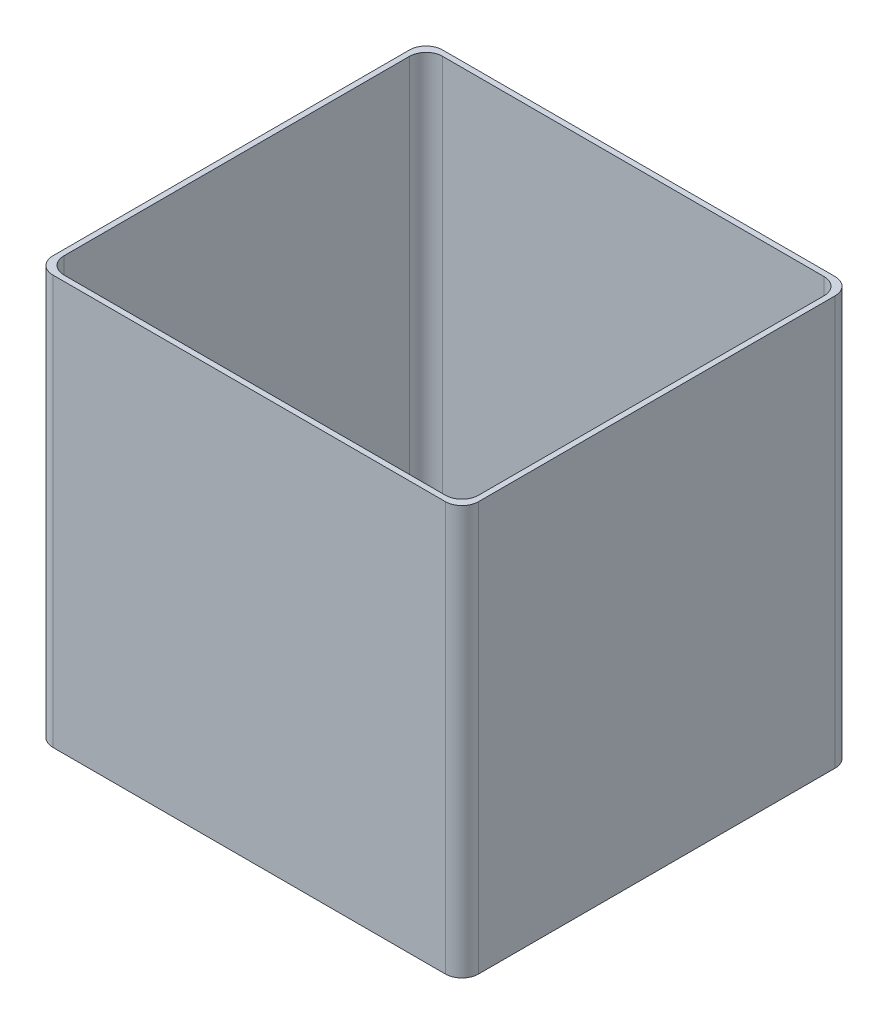
ISO-10303-21;
HEADER;
FILE_DESCRIPTION(('STEP AP214'),'2;1');
FILE_NAME('part.step','',(''),(''),'','','');
FILE_SCHEMA(('AUTOMOTIVE_DESIGN { 1 0 10303 214 1 1 1 1 }'));
ENDSEC;
DATA;
#1=APPLICATION_CONTEXT('core data for automotive mechanical design processes');
#2=APPLICATION_PROTOCOL_DEFINITION('international standard','automotive_design',2000,#1);
#3=PRODUCT_CONTEXT('',#1,'mechanical');
#4=PRODUCT('Part','Part','',(#3));
#5=PRODUCT_RELATED_PRODUCT_CATEGORY('part','',(#4));
#6=PRODUCT_DEFINITION_FORMATION('','',#4);
#7=PRODUCT_DEFINITION_CONTEXT('part definition',#1,'design');
#8=PRODUCT_DEFINITION('design','',#6,#7);
#9=PRODUCT_DEFINITION_SHAPE('','',#8);
#10=(LENGTH_UNIT() NAMED_UNIT(*) SI_UNIT(.MILLI.,.METRE.));
#11=(NAMED_UNIT(*) PLANE_ANGLE_UNIT() SI_UNIT($,.RADIAN.));
#12=(NAMED_UNIT(*) SI_UNIT($,.STERADIAN.) SOLID_ANGLE_UNIT());
#13=UNCERTAINTY_MEASURE_WITH_UNIT(LENGTH_MEASURE(1.E-05),#10,'distance_accuracy_value','');
#14=(GEOMETRIC_REPRESENTATION_CONTEXT(3) GLOBAL_UNCERTAINTY_ASSIGNED_CONTEXT((#13)) GLOBAL_UNIT_ASSIGNED_CONTEXT((#10,
#11,#12)) REPRESENTATION_CONTEXT('',''));
#15=CARTESIAN_POINT('',(0.,0.,0.));
#16=DIRECTION('',(0.,0.,1.));
#17=DIRECTION('',(1.,0.,0.));
#18=AXIS2_PLACEMENT_3D('',#15,#16,#17);
#19=CARTESIAN_POINT('',(54.9031303622844,148.,-101.613007283359));
#20=DIRECTION('',(0.,-1.,0.));
#21=DIRECTION('',(0.,0.,-1.));
#22=AXIS2_PLACEMENT_3D('',#19,#20,#21);
#23=CYLINDRICAL_SURFACE('',#22,6.);
#24=DIRECTION('',(0.,1.,0.));
#25=VECTOR('',#24,1.);
#26=CARTESIAN_POINT('',(54.9031303622844,148.,-107.613007283359));
#27=LINE('',#26,#25);
#28=CARTESIAN_POINT('',(54.9031303622844,2.,-107.613007283359));
#29=VERTEX_POINT('',#28);
#30=CARTESIAN_POINT('',(54.9031303622844,148.,-107.613007283359));
#31=VERTEX_POINT('',#30);
#32=EDGE_CURVE('E243',#29,#31,#27,.T.);
#33=ORIENTED_EDGE('',*,*,#32,.F.);
#34=CARTESIAN_POINT('',(54.9031303622844,2.,-101.613007283359));
#35=DIRECTION('',(0.,-1.,0.));
#36=DIRECTION('',(0.,0.,-1.));
#37=AXIS2_PLACEMENT_3D('',#34,#35,#36);
#38=CIRCLE('',#37,6.);
#39=CARTESIAN_POINT('',(60.9031303622844,2.,-101.613007283359));
#40=VERTEX_POINT('',#39);
#41=EDGE_CURVE('E40',#40,#29,#38,.F.);
#42=ORIENTED_EDGE('',*,*,#41,.F.);
#43=DIRECTION('',(0.,1.,0.));
#44=VECTOR('',#43,1.);
#45=CARTESIAN_POINT('',(60.9031303622844,148.,-101.613007283359));
#46=LINE('',#45,#44);
#47=CARTESIAN_POINT('',(60.9031303622844,148.,-101.613007283359));
#48=VERTEX_POINT('',#47);
#49=EDGE_CURVE('E246',#48,#40,#46,.F.);
#50=ORIENTED_EDGE('',*,*,#49,.F.);
#51=CARTESIAN_POINT('',(54.9031303622844,148.,-101.613007283359));
#52=DIRECTION('',(0.,1.,0.));
#53=DIRECTION('',(0.,0.,1.));
#54=AXIS2_PLACEMENT_3D('',#51,#52,#53);
#55=CIRCLE('',#54,6.);
#56=EDGE_CURVE('E11',#48,#31,#55,.T.);
#57=ORIENTED_EDGE('',*,*,#56,.T.);
#58=EDGE_LOOP('',(#33,#42,#50,#57));
#59=FACE_BOUND('',#58,.T.);
#60=ADVANCED_FACE('F33',(#59),#23,.F.);
#61=CARTESIAN_POINT('',(-83.0968696377156,148.,-101.613007283359));
#62=DIRECTION('',(0.,1.,0.));
#63=DIRECTION('',(0.,0.,1.));
#64=AXIS2_PLACEMENT_3D('',#61,#62,#63);
#65=CYLINDRICAL_SURFACE('',#64,6.);
#66=DIRECTION('',(0.,-1.,0.));
#67=VECTOR('',#66,1.);
#68=CARTESIAN_POINT('',(-83.0968696377156,148.,-107.613007283359));
#69=LINE('',#68,#67);
#70=CARTESIAN_POINT('',(-83.0968696377156,148.,-107.613007283359));
#71=VERTEX_POINT('',#70);
#72=CARTESIAN_POINT('',(-83.0968696377156,2.,-107.613007283359));
#73=VERTEX_POINT('',#72);
#74=EDGE_CURVE('E233',#71,#73,#69,.T.);
#75=ORIENTED_EDGE('',*,*,#74,.F.);
#76=CARTESIAN_POINT('',(-83.0968696377156,148.,-101.613007283359));
#77=DIRECTION('',(0.,1.,0.));
#78=DIRECTION('',(0.,0.,1.));
#79=AXIS2_PLACEMENT_3D('',#76,#77,#78);
#80=CIRCLE('',#79,6.);
#81=CARTESIAN_POINT('',(-89.0968696377156,148.,-101.613007283359));
#82=VERTEX_POINT('',#81);
#83=EDGE_CURVE('E241',#71,#82,#80,.T.);
#84=ORIENTED_EDGE('',*,*,#83,.T.);
#85=DIRECTION('',(0.,-1.,0.));
#86=VECTOR('',#85,1.);
#87=CARTESIAN_POINT('',(-89.0968696377156,148.,-101.613007283359));
#88=LINE('',#87,#86);
#89=CARTESIAN_POINT('',(-89.0968696377156,2.,-101.613007283359));
#90=VERTEX_POINT('',#89);
#91=EDGE_CURVE('E236',#90,#82,#88,.F.);
#92=ORIENTED_EDGE('',*,*,#91,.F.);
#93=CARTESIAN_POINT('',(-83.0968696377156,2.,-101.613007283359));
#94=DIRECTION('',(0.,-1.,0.));
#95=DIRECTION('',(0.,0.,-1.));
#96=AXIS2_PLACEMENT_3D('',#93,#94,#95);
#97=CIRCLE('',#96,6.);
#98=EDGE_CURVE('E239',#73,#90,#97,.F.);
#99=ORIENTED_EDGE('',*,*,#98,.F.);
#100=EDGE_LOOP('',(#75,#84,#92,#99));
#101=FACE_BOUND('',#100,.T.);
#102=ADVANCED_FACE('F312',(#101),#65,.F.);
#103=CARTESIAN_POINT('',(-85.0968696377156,148.,-103.613007283359));
#104=DIRECTION('',(0.,-1.,0.));
#105=DIRECTION('',(0.,0.,-1.));
#106=AXIS2_PLACEMENT_3D('',#103,#104,#105);
#107=CYLINDRICAL_SURFACE('',#106,6.);
#108=DIRECTION('',(0.,-1.,0.));
#109=VECTOR('',#108,1.);
#110=CARTESIAN_POINT('',(-91.0968696377156,148.,-103.613007283359));
#111=LINE('',#110,#109);
#112=CARTESIAN_POINT('',(-91.0968696377156,148.,-103.613007283359));
#113=VERTEX_POINT('',#112);
#114=CARTESIAN_POINT('',(-91.0968696377156,0.,-103.613007283359));
#115=VERTEX_POINT('',#114);
#116=EDGE_CURVE('E223',#113,#115,#111,.T.);
#117=ORIENTED_EDGE('',*,*,#116,.F.);
#118=CARTESIAN_POINT('',(-85.0968696377156,148.,-103.613007283359));
#119=DIRECTION('',(0.,1.,0.));
#120=DIRECTION('',(0.,0.,1.));
#121=AXIS2_PLACEMENT_3D('',#118,#119,#120);
#122=CIRCLE('',#121,6.);
#123=CARTESIAN_POINT('',(-85.0968696377156,148.,-109.613007283359));
#124=VERTEX_POINT('',#123);
#125=EDGE_CURVE('E229',#124,#113,#122,.T.);
#126=ORIENTED_EDGE('',*,*,#125,.F.);
#127=DIRECTION('',(0.,-1.,0.));
#128=VECTOR('',#127,1.);
#129=CARTESIAN_POINT('',(-85.0968696377156,148.,-109.613007283359));
#130=LINE('',#129,#128);
#131=CARTESIAN_POINT('',(-85.0968696377156,0.,-109.613007283359));
#132=VERTEX_POINT('',#131);
#133=EDGE_CURVE('E226',#132,#124,#130,.F.);
#134=ORIENTED_EDGE('',*,*,#133,.F.);
#135=CARTESIAN_POINT('',(-85.0968696377156,0.,-103.613007283359));
#136=DIRECTION('',(0.,1.,0.));
#137=DIRECTION('',(0.,0.,1.));
#138=AXIS2_PLACEMENT_3D('',#135,#136,#137);
#139=CIRCLE('',#138,6.);
#140=EDGE_CURVE('E231',#115,#132,#139,.F.);
#141=ORIENTED_EDGE('',*,*,#140,.F.);
#142=EDGE_LOOP('',(#117,#126,#134,#141));
#143=FACE_BOUND('',#142,.T.);
#144=ADVANCED_FACE('F295',(#143),#107,.T.);
#145=CARTESIAN_POINT('',(56.9031303622844,148.,-103.613007283359));
#146=DIRECTION('',(0.,-1.,0.));
#147=DIRECTION('',(0.,0.,-1.));
#148=AXIS2_PLACEMENT_3D('',#145,#146,#147);
#149=CYLINDRICAL_SURFACE('',#148,6.);
#150=DIRECTION('',(0.,-1.,0.));
#151=VECTOR('',#150,1.);
#152=CARTESIAN_POINT('',(56.9031303622844,148.,-109.613007283359));
#153=LINE('',#152,#151);
#154=CARTESIAN_POINT('',(56.9031303622844,148.,-109.613007283359));
#155=VERTEX_POINT('',#154);
#156=CARTESIAN_POINT('',(56.9031303622844,0.,-109.613007283359));
#157=VERTEX_POINT('',#156);
#158=EDGE_CURVE('E215',#155,#157,#153,.T.);
#159=ORIENTED_EDGE('',*,*,#158,.F.);
#160=CARTESIAN_POINT('',(56.9031303622844,148.,-103.613007283359));
#161=DIRECTION('',(0.,1.,0.));
#162=DIRECTION('',(0.,0.,1.));
#163=AXIS2_PLACEMENT_3D('',#160,#161,#162);
#164=CIRCLE('',#163,6.);
#165=CARTESIAN_POINT('',(62.9031303622844,148.,-103.613007283359));
#166=VERTEX_POINT('',#165);
#167=EDGE_CURVE('E220',#166,#155,#164,.T.);
#168=ORIENTED_EDGE('',*,*,#167,.F.);
#169=DIRECTION('',(0.,-1.,0.));
#170=VECTOR('',#169,1.);
#171=CARTESIAN_POINT('',(62.9031303622844,148.,-103.613007283359));
#172=LINE('',#171,#170);
#173=CARTESIAN_POINT('',(62.9031303622844,0.,-103.613007283359));
#174=VERTEX_POINT('',#173);
#175=EDGE_CURVE('E218',#174,#166,#172,.F.);
#176=ORIENTED_EDGE('',*,*,#175,.F.);
#177=CARTESIAN_POINT('',(56.9031303622844,0.,-103.613007283359));
#178=DIRECTION('',(0.,1.,0.));
#179=DIRECTION('',(0.,0.,1.));
#180=AXIS2_PLACEMENT_3D('',#177,#178,#179);
#181=CIRCLE('',#180,6.);
#182=EDGE_CURVE('E170',#157,#174,#181,.F.);
#183=ORIENTED_EDGE('',*,*,#182,.F.);
#184=EDGE_LOOP('',(#159,#168,#176,#183));
#185=FACE_BOUND('',#184,.T.);
#186=ADVANCED_FACE('F300',(#185),#149,.T.);
#187=CARTESIAN_POINT('',(-85.0968696377156,148.,25.3869927166415));
#188=DIRECTION('',(0.,1.,0.));
#189=DIRECTION('',(0.,0.,1.));
#190=AXIS2_PLACEMENT_3D('',#187,#188,#189);
#191=CYLINDRICAL_SURFACE('',#190,6.);
#192=DIRECTION('',(0.,1.,0.));
#193=VECTOR('',#192,1.);
#194=CARTESIAN_POINT('',(-91.0968696377156,148.,25.3869927166415));
#195=LINE('',#194,#193);
#196=CARTESIAN_POINT('',(-91.0968696377156,0.,25.3869927166415));
#197=VERTEX_POINT('',#196);
#198=CARTESIAN_POINT('',(-91.0968696377156,148.,25.3869927166415));
#199=VERTEX_POINT('',#198);
#200=EDGE_CURVE('E204',#197,#199,#195,.T.);
#201=ORIENTED_EDGE('',*,*,#200,.F.);
#202=CARTESIAN_POINT('',(-85.0968696377156,0.,25.3869927166415));
#203=DIRECTION('',(0.,1.,0.));
#204=DIRECTION('',(0.,0.,1.));
#205=AXIS2_PLACEMENT_3D('',#202,#203,#204);
#206=CIRCLE('',#205,6.);
#207=CARTESIAN_POINT('',(-85.0968696377156,0.,31.3869927166415));
#208=VERTEX_POINT('',#207);
#209=EDGE_CURVE('E210',#208,#197,#206,.F.);
#210=ORIENTED_EDGE('',*,*,#209,.F.);
#211=DIRECTION('',(0.,1.,0.));
#212=VECTOR('',#211,1.);
#213=CARTESIAN_POINT('',(-85.0968696377156,148.,31.3869927166415));
#214=LINE('',#213,#212);
#215=CARTESIAN_POINT('',(-85.0968696377156,148.,31.3869927166415));
#216=VERTEX_POINT('',#215);
#217=EDGE_CURVE('E207',#216,#208,#214,.F.);
#218=ORIENTED_EDGE('',*,*,#217,.F.);
#219=CARTESIAN_POINT('',(-85.0968696377156,148.,25.3869927166415));
#220=DIRECTION('',(0.,1.,0.));
#221=DIRECTION('',(0.,0.,1.));
#222=AXIS2_PLACEMENT_3D('',#219,#220,#221);
#223=CIRCLE('',#222,6.);
#224=EDGE_CURVE('E213',#199,#216,#223,.T.);
#225=ORIENTED_EDGE('',*,*,#224,.F.);
#226=EDGE_LOOP('',(#201,#210,#218,#225));
#227=FACE_BOUND('',#226,.T.);
#228=ADVANCED_FACE('F288',(#227),#191,.T.);
#229=CARTESIAN_POINT('',(-83.0968696377156,148.,23.3869927166415));
#230=DIRECTION('',(0.,1.,0.));
#231=DIRECTION('',(0.,0.,1.));
#232=AXIS2_PLACEMENT_3D('',#229,#230,#231);
#233=CYLINDRICAL_SURFACE('',#232,6.);
#234=DIRECTION('',(0.,-1.,0.));
#235=VECTOR('',#234,1.);
#236=CARTESIAN_POINT('',(-89.0968696377156,148.,23.3869927166415));
#237=LINE('',#236,#235);
#238=CARTESIAN_POINT('',(-89.0968696377156,148.,23.3869927166415));
#239=VERTEX_POINT('',#238);
#240=CARTESIAN_POINT('',(-89.0968696377156,2.,23.3869927166415));
#241=VERTEX_POINT('',#240);
#242=EDGE_CURVE('E194',#239,#241,#237,.T.);
#243=ORIENTED_EDGE('',*,*,#242,.F.);
#244=CARTESIAN_POINT('',(-83.0968696377156,148.,23.3869927166415));
#245=DIRECTION('',(0.,1.,0.));
#246=DIRECTION('',(0.,0.,1.));
#247=AXIS2_PLACEMENT_3D('',#244,#245,#246);
#248=CIRCLE('',#247,6.);
#249=CARTESIAN_POINT('',(-83.0968696377156,148.,29.3869927166415));
#250=VERTEX_POINT('',#249);
#251=EDGE_CURVE('E202',#239,#250,#248,.T.);
#252=ORIENTED_EDGE('',*,*,#251,.T.);
#253=DIRECTION('',(0.,-1.,0.));
#254=VECTOR('',#253,1.);
#255=CARTESIAN_POINT('',(-83.0968696377156,148.,29.3869927166415));
#256=LINE('',#255,#254);
#257=CARTESIAN_POINT('',(-83.0968696377156,2.,29.3869927166415));
#258=VERTEX_POINT('',#257);
#259=EDGE_CURVE('E197',#258,#250,#256,.F.);
#260=ORIENTED_EDGE('',*,*,#259,.F.);
#261=CARTESIAN_POINT('',(-83.0968696377156,2.,23.3869927166415));
#262=DIRECTION('',(0.,-1.,0.));
#263=DIRECTION('',(0.,0.,-1.));
#264=AXIS2_PLACEMENT_3D('',#261,#262,#263);
#265=CIRCLE('',#264,6.);
#266=EDGE_CURVE('E200',#241,#258,#265,.F.);
#267=ORIENTED_EDGE('',*,*,#266,.F.);
#268=EDGE_LOOP('',(#243,#252,#260,#267));
#269=FACE_BOUND('',#268,.T.);
#270=ADVANCED_FACE('F327',(#269),#233,.F.);
#271=CARTESIAN_POINT('',(54.9031303622844,148.,23.3869927166415));
#272=DIRECTION('',(0.,-1.,0.));
#273=DIRECTION('',(0.,0.,-1.));
#274=AXIS2_PLACEMENT_3D('',#271,#272,#273);
#275=CYLINDRICAL_SURFACE('',#274,6.);
#276=DIRECTION('',(0.,1.,0.));
#277=VECTOR('',#276,1.);
#278=CARTESIAN_POINT('',(60.9031303622844,148.,23.3869927166415));
#279=LINE('',#278,#277);
#280=CARTESIAN_POINT('',(60.9031303622844,2.,23.3869927166415));
#281=VERTEX_POINT('',#280);
#282=CARTESIAN_POINT('',(60.9031303622844,148.,23.3869927166415));
#283=VERTEX_POINT('',#282);
#284=EDGE_CURVE('E155',#281,#283,#279,.T.);
#285=ORIENTED_EDGE('',*,*,#284,.F.);
#286=CARTESIAN_POINT('',(54.9031303622844,2.,23.3869927166415));
#287=DIRECTION('',(0.,-1.,0.));
#288=DIRECTION('',(0.,0.,-1.));
#289=AXIS2_PLACEMENT_3D('',#286,#287,#288);
#290=CIRCLE('',#289,6.);
#291=CARTESIAN_POINT('',(54.9031303622844,2.,29.3869927166415));
#292=VERTEX_POINT('',#291);
#293=EDGE_CURVE('E189',#292,#281,#290,.F.);
#294=ORIENTED_EDGE('',*,*,#293,.F.);
#295=DIRECTION('',(0.,1.,0.));
#296=VECTOR('',#295,1.);
#297=CARTESIAN_POINT('',(54.9031303622844,148.,29.3869927166415));
#298=LINE('',#297,#296);
#299=CARTESIAN_POINT('',(54.9031303622844,148.,29.3869927166415));
#300=VERTEX_POINT('',#299);
#301=EDGE_CURVE('E186',#300,#292,#298,.F.);
#302=ORIENTED_EDGE('',*,*,#301,.F.);
#303=CARTESIAN_POINT('',(54.9031303622844,148.,23.3869927166415));
#304=DIRECTION('',(0.,1.,0.));
#305=DIRECTION('',(0.,0.,1.));
#306=AXIS2_PLACEMENT_3D('',#303,#304,#305);
#307=CIRCLE('',#306,6.);
#308=EDGE_CURVE('E192',#300,#283,#307,.T.);
#309=ORIENTED_EDGE('',*,*,#308,.T.);
#310=EDGE_LOOP('',(#285,#294,#302,#309));
#311=FACE_BOUND('',#310,.T.);
#312=ADVANCED_FACE('F330',(#311),#275,.F.);
#313=CARTESIAN_POINT('',(56.9031303622844,148.,25.3869927166415));
#314=DIRECTION('',(0.,-1.,0.));
#315=DIRECTION('',(0.,0.,-1.));
#316=AXIS2_PLACEMENT_3D('',#313,#314,#315);
#317=CYLINDRICAL_SURFACE('',#316,6.);
#318=DIRECTION('',(0.,-1.,0.));
#319=VECTOR('',#318,1.);
#320=CARTESIAN_POINT('',(62.9031303622844,148.,25.3869927166415));
#321=LINE('',#320,#319);
#322=CARTESIAN_POINT('',(62.9031303622844,148.,25.3869927166415));
#323=VERTEX_POINT('',#322);
#324=CARTESIAN_POINT('',(62.9031303622844,0.,25.3869927166415));
#325=VERTEX_POINT('',#324);
#326=EDGE_CURVE('E148',#323,#325,#321,.T.);
#327=ORIENTED_EDGE('',*,*,#326,.F.);
#328=CARTESIAN_POINT('',(56.9031303622844,148.,25.3869927166415));
#329=DIRECTION('',(0.,1.,0.));
#330=DIRECTION('',(0.,0.,1.));
#331=AXIS2_PLACEMENT_3D('',#328,#329,#330);
#332=CIRCLE('',#331,6.);
#333=CARTESIAN_POINT('',(56.9031303622844,148.,31.3869927166415));
#334=VERTEX_POINT('',#333);
#335=EDGE_CURVE('E156',#334,#323,#332,.T.);
#336=ORIENTED_EDGE('',*,*,#335,.F.);
#337=DIRECTION('',(0.,-1.,0.));
#338=VECTOR('',#337,1.);
#339=CARTESIAN_POINT('',(56.9031303622844,148.,31.3869927166415));
#340=LINE('',#339,#338);
#341=CARTESIAN_POINT('',(56.9031303622844,0.,31.3869927166415));
#342=VERTEX_POINT('',#341);
#343=EDGE_CURVE('E151',#342,#334,#340,.F.);
#344=ORIENTED_EDGE('',*,*,#343,.F.);
#345=CARTESIAN_POINT('',(56.9031303622844,0.,25.3869927166415));
#346=DIRECTION('',(0.,1.,0.));
#347=DIRECTION('',(0.,0.,1.));
#348=AXIS2_PLACEMENT_3D('',#345,#346,#347);
#349=CIRCLE('',#348,6.);
#350=EDGE_CURVE('E144',#325,#342,#349,.F.);
#351=ORIENTED_EDGE('',*,*,#350,.F.);
#352=EDGE_LOOP('',(#327,#336,#344,#351));
#353=FACE_BOUND('',#352,.T.);
#354=ADVANCED_FACE('F146',(#353),#317,.T.);
#355=CARTESIAN_POINT('',(-89.0968696377156,148.,-107.613007283359));
#356=DIRECTION('',(1.,0.,0.));
#357=DIRECTION('',(0.,0.,-1.));
#358=AXIS2_PLACEMENT_3D('',#355,#356,#357);
#359=PLANE('',#358);
#360=DIRECTION('',(0.,0.,-1.));
#361=VECTOR('',#360,1.);
#362=CARTESIAN_POINT('',(-89.0968696377156,2.,29.3869927166415));
#363=LINE('',#362,#361);
#364=EDGE_CURVE('E257',#241,#90,#363,.T.);
#365=ORIENTED_EDGE('',*,*,#364,.T.);
#366=ORIENTED_EDGE('',*,*,#91,.T.);
#367=DIRECTION('',(0.,0.,1.));
#368=VECTOR('',#367,1.);
#369=CARTESIAN_POINT('',(-89.0968696377156,148.,-107.613007283359));
#370=LINE('',#369,#368);
#371=EDGE_CURVE('E266',#82,#239,#370,.T.);
#372=ORIENTED_EDGE('',*,*,#371,.T.);
#373=ORIENTED_EDGE('',*,*,#242,.T.);
#374=EDGE_LOOP('',(#365,#366,#372,#373));
#375=FACE_BOUND('',#374,.T.);
#376=ADVANCED_FACE('F336',(#375),#359,.T.);
#377=CARTESIAN_POINT('',(-89.0968696377156,148.,29.3869927166415));
#378=DIRECTION('',(0.,0.,-1.));
#379=DIRECTION('',(-1.,0.,0.));
#380=AXIS2_PLACEMENT_3D('',#377,#378,#379);
#381=PLANE('',#380);
#382=DIRECTION('',(-1.,0.,0.));
#383=VECTOR('',#382,1.);
#384=CARTESIAN_POINT('',(-89.0968696377156,2.,29.3869927166415));
#385=LINE('',#384,#383);
#386=EDGE_CURVE('E259',#292,#258,#385,.T.);
#387=ORIENTED_EDGE('',*,*,#386,.T.);
#388=ORIENTED_EDGE('',*,*,#259,.T.);
#389=DIRECTION('',(1.,0.,0.));
#390=VECTOR('',#389,1.);
#391=CARTESIAN_POINT('',(-89.0968696377156,148.,29.3869927166415));
#392=LINE('',#391,#390);
#393=EDGE_CURVE('E268',#250,#300,#392,.T.);
#394=ORIENTED_EDGE('',*,*,#393,.T.);
#395=ORIENTED_EDGE('',*,*,#301,.T.);
#396=EDGE_LOOP('',(#387,#388,#394,#395));
#397=FACE_BOUND('',#396,.T.);
#398=ADVANCED_FACE('F340',(#397),#381,.T.);
#399=CARTESIAN_POINT('',(60.9031303622844,148.,-107.613007283359));
#400=DIRECTION('',(-1.,0.,0.));
#401=DIRECTION('',(0.,0.,1.));
#402=AXIS2_PLACEMENT_3D('',#399,#400,#401);
#403=PLANE('',#402);
#404=DIRECTION('',(0.,0.,-1.));
#405=VECTOR('',#404,1.);
#406=CARTESIAN_POINT('',(60.9031303622844,148.,-107.613007283359));
#407=LINE('',#406,#405);
#408=EDGE_CURVE('E270',#283,#48,#407,.T.);
#409=ORIENTED_EDGE('',*,*,#408,.T.);
#410=ORIENTED_EDGE('',*,*,#49,.T.);
#411=DIRECTION('',(0.,0.,1.));
#412=VECTOR('',#411,1.);
#413=CARTESIAN_POINT('',(60.9031303622844,2.,29.3869927166415));
#414=LINE('',#413,#412);
#415=EDGE_CURVE('E253',#40,#281,#414,.T.);
#416=ORIENTED_EDGE('',*,*,#415,.T.);
#417=ORIENTED_EDGE('',*,*,#284,.T.);
#418=EDGE_LOOP('',(#409,#410,#416,#417));
#419=FACE_BOUND('',#418,.T.);
#420=ADVANCED_FACE('F346',(#419),#403,.T.);
#421=CARTESIAN_POINT('',(-89.0968696377156,148.,-107.613007283359));
#422=DIRECTION('',(0.,0.,1.));
#423=DIRECTION('',(1.,0.,0.));
#424=AXIS2_PLACEMENT_3D('',#421,#422,#423);
#425=PLANE('',#424);
#426=DIRECTION('',(1.,0.,0.));
#427=VECTOR('',#426,1.);
#428=CARTESIAN_POINT('',(-89.0968696377156,2.,-107.613007283359));
#429=LINE('',#428,#427);
#430=EDGE_CURVE('E252',#73,#29,#429,.T.);
#431=ORIENTED_EDGE('',*,*,#430,.T.);
#432=ORIENTED_EDGE('',*,*,#32,.T.);
#433=DIRECTION('',(-1.,0.,0.));
#434=VECTOR('',#433,1.);
#435=CARTESIAN_POINT('',(-89.0968696377156,148.,-107.613007283359));
#436=LINE('',#435,#434);
#437=EDGE_CURVE('E273',#31,#71,#436,.T.);
#438=ORIENTED_EDGE('',*,*,#437,.T.);
#439=ORIENTED_EDGE('',*,*,#74,.T.);
#440=EDGE_LOOP('',(#431,#432,#438,#439));
#441=FACE_BOUND('',#440,.T.);
#442=ADVANCED_FACE('F255',(#441),#425,.T.);
#443=CARTESIAN_POINT('',(0.,148.,0.));
#444=DIRECTION('',(0.,1.,0.));
#445=DIRECTION('',(0.,0.,1.));
#446=AXIS2_PLACEMENT_3D('',#443,#444,#445);
#447=PLANE('',#446);
#448=DIRECTION('',(-1.,0.,0.));
#449=VECTOR('',#448,1.);
#450=CARTESIAN_POINT('',(-91.0968696377156,148.,-109.613007283359));
#451=LINE('',#450,#449);
#452=EDGE_CURVE('E165',#155,#124,#451,.T.);
#453=ORIENTED_EDGE('',*,*,#452,.T.);
#454=ORIENTED_EDGE('',*,*,#125,.T.);
#455=DIRECTION('',(0.,0.,1.));
#456=VECTOR('',#455,1.);
#457=CARTESIAN_POINT('',(-91.0968696377156,148.,-109.613007283359));
#458=LINE('',#457,#456);
#459=EDGE_CURVE('E176',#113,#199,#458,.T.);
#460=ORIENTED_EDGE('',*,*,#459,.T.);
#461=ORIENTED_EDGE('',*,*,#224,.T.);
#462=DIRECTION('',(1.,0.,0.));
#463=VECTOR('',#462,1.);
#464=CARTESIAN_POINT('',(-91.0968696377156,148.,31.3869927166415));
#465=LINE('',#464,#463);
#466=EDGE_CURVE('E276',#216,#334,#465,.T.);
#467=ORIENTED_EDGE('',*,*,#466,.T.);
#468=ORIENTED_EDGE('',*,*,#335,.T.);
#469=DIRECTION('',(0.,0.,-1.));
#470=VECTOR('',#469,1.);
#471=CARTESIAN_POINT('',(62.9031303622844,148.,-109.613007283359));
#472=LINE('',#471,#470);
#473=EDGE_CURVE('E164',#323,#166,#472,.T.);
#474=ORIENTED_EDGE('',*,*,#473,.T.);
#475=ORIENTED_EDGE('',*,*,#167,.T.);
#476=EDGE_LOOP('',(#453,#454,#460,#461,#467,#468,#474,#475));
#477=FACE_BOUND('',#476,.T.);
#478=ORIENTED_EDGE('',*,*,#393,.F.);
#479=ORIENTED_EDGE('',*,*,#251,.F.);
#480=ORIENTED_EDGE('',*,*,#371,.F.);
#481=ORIENTED_EDGE('',*,*,#83,.F.);
#482=ORIENTED_EDGE('',*,*,#437,.F.);
#483=ORIENTED_EDGE('',*,*,#56,.F.);
#484=ORIENTED_EDGE('',*,*,#408,.F.);
#485=ORIENTED_EDGE('',*,*,#308,.F.);
#486=EDGE_LOOP('',(#478,#479,#480,#481,#482,#483,#484,#485));
#487=FACE_BOUND('',#486,.T.);
#488=ADVANCED_FACE('F291',(#477,#487),#447,.T.);
#489=CARTESIAN_POINT('',(0.,0.,0.));
#490=DIRECTION('',(0.,1.,0.));
#491=DIRECTION('',(0.,0.,1.));
#492=AXIS2_PLACEMENT_3D('',#489,#490,#491);
#493=PLANE('',#492);
#494=DIRECTION('',(0.,0.,1.));
#495=VECTOR('',#494,1.);
#496=CARTESIAN_POINT('',(-91.0968696377156,0.,-109.613007283359));
#497=LINE('',#496,#495);
#498=EDGE_CURVE('E178',#115,#197,#497,.T.);
#499=ORIENTED_EDGE('',*,*,#498,.F.);
#500=ORIENTED_EDGE('',*,*,#140,.T.);
#501=DIRECTION('',(-1.,0.,0.));
#502=VECTOR('',#501,1.);
#503=CARTESIAN_POINT('',(-91.0968696377156,0.,-109.613007283359));
#504=LINE('',#503,#502);
#505=EDGE_CURVE('E172',#157,#132,#504,.T.);
#506=ORIENTED_EDGE('',*,*,#505,.F.);
#507=ORIENTED_EDGE('',*,*,#182,.T.);
#508=DIRECTION('',(0.,0.,-1.));
#509=VECTOR('',#508,1.);
#510=CARTESIAN_POINT('',(62.9031303622844,0.,-109.613007283359));
#511=LINE('',#510,#509);
#512=EDGE_CURVE('E162',#325,#174,#511,.T.);
#513=ORIENTED_EDGE('',*,*,#512,.F.);
#514=ORIENTED_EDGE('',*,*,#350,.T.);
#515=DIRECTION('',(1.,0.,0.));
#516=VECTOR('',#515,1.);
#517=CARTESIAN_POINT('',(-91.0968696377156,0.,31.3869927166415));
#518=LINE('',#517,#516);
#519=EDGE_CURVE('E173',#208,#342,#518,.T.);
#520=ORIENTED_EDGE('',*,*,#519,.F.);
#521=ORIENTED_EDGE('',*,*,#209,.T.);
#522=EDGE_LOOP('',(#499,#500,#506,#507,#513,#514,#520,#521));
#523=FACE_BOUND('',#522,.T.);
#524=ADVANCED_FACE('F168',(#523),#493,.F.);
#525=CARTESIAN_POINT('',(-91.0968696377156,148.,-109.613007283359));
#526=DIRECTION('',(1.,0.,0.));
#527=DIRECTION('',(0.,0.,-1.));
#528=AXIS2_PLACEMENT_3D('',#525,#526,#527);
#529=PLANE('',#528);
#530=ORIENTED_EDGE('',*,*,#459,.F.);
#531=ORIENTED_EDGE('',*,*,#116,.T.);
#532=ORIENTED_EDGE('',*,*,#498,.T.);
#533=ORIENTED_EDGE('',*,*,#200,.T.);
#534=EDGE_LOOP('',(#530,#531,#532,#533));
#535=FACE_BOUND('',#534,.T.);
#536=ADVANCED_FACE('F282',(#535),#529,.F.);
#537=CARTESIAN_POINT('',(-91.0968696377156,148.,31.3869927166415));
#538=DIRECTION('',(0.,0.,-1.));
#539=DIRECTION('',(-1.,0.,0.));
#540=AXIS2_PLACEMENT_3D('',#537,#538,#539);
#541=PLANE('',#540);
#542=ORIENTED_EDGE('',*,*,#466,.F.);
#543=ORIENTED_EDGE('',*,*,#217,.T.);
#544=ORIENTED_EDGE('',*,*,#519,.T.);
#545=ORIENTED_EDGE('',*,*,#343,.T.);
#546=EDGE_LOOP('',(#542,#543,#544,#545));
#547=FACE_BOUND('',#546,.T.);
#548=ADVANCED_FACE('F302',(#547),#541,.F.);
#549=CARTESIAN_POINT('',(62.9031303622844,148.,-109.613007283359));
#550=DIRECTION('',(-1.,0.,0.));
#551=DIRECTION('',(0.,0.,1.));
#552=AXIS2_PLACEMENT_3D('',#549,#550,#551);
#553=PLANE('',#552);
#554=ORIENTED_EDGE('',*,*,#512,.T.);
#555=ORIENTED_EDGE('',*,*,#175,.T.);
#556=ORIENTED_EDGE('',*,*,#473,.F.);
#557=ORIENTED_EDGE('',*,*,#326,.T.);
#558=EDGE_LOOP('',(#554,#555,#556,#557));
#559=FACE_BOUND('',#558,.T.);
#560=ADVANCED_FACE('F160',(#559),#553,.F.);
#561=CARTESIAN_POINT('',(-91.0968696377156,148.,-109.613007283359));
#562=DIRECTION('',(0.,0.,1.));
#563=DIRECTION('',(1.,0.,0.));
#564=AXIS2_PLACEMENT_3D('',#561,#562,#563);
#565=PLANE('',#564);
#566=ORIENTED_EDGE('',*,*,#505,.T.);
#567=ORIENTED_EDGE('',*,*,#133,.T.);
#568=ORIENTED_EDGE('',*,*,#452,.F.);
#569=ORIENTED_EDGE('',*,*,#158,.T.);
#570=EDGE_LOOP('',(#566,#567,#568,#569));
#571=FACE_BOUND('',#570,.T.);
#572=ADVANCED_FACE('F297',(#571),#565,.F.);
#573=CARTESIAN_POINT('',(0.,2.,0.));
#574=DIRECTION('',(0.,-1.,0.));
#575=DIRECTION('',(0.,0.,-1.));
#576=AXIS2_PLACEMENT_3D('',#573,#574,#575);
#577=PLANE('',#576);
#578=ORIENTED_EDGE('',*,*,#415,.F.);
#579=ORIENTED_EDGE('',*,*,#41,.T.);
#580=ORIENTED_EDGE('',*,*,#430,.F.);
#581=ORIENTED_EDGE('',*,*,#98,.T.);
#582=ORIENTED_EDGE('',*,*,#364,.F.);
#583=ORIENTED_EDGE('',*,*,#266,.T.);
#584=ORIENTED_EDGE('',*,*,#386,.F.);
#585=ORIENTED_EDGE('',*,*,#293,.T.);
#586=EDGE_LOOP('',(#578,#579,#580,#581,#582,#583,#584,#585));
#587=FACE_BOUND('',#586,.T.);
#588=ADVANCED_FACE('F250',(#587),#577,.F.);
#589=CLOSED_SHELL('',(#60,#102,#144,#186,#228,#270,#312,#354,#376,#398,#420,#442,#488,#524,#536,
#548,#560,#572,#588));
#590=MANIFOLD_SOLID_BREP('B2',#589);
#591=ADVANCED_BREP_SHAPE_REPRESENTATION('',(#18,#590),#14);
#592=SHAPE_DEFINITION_REPRESENTATION(#9,#591);
ENDSEC;
END-ISO-10303-21;
